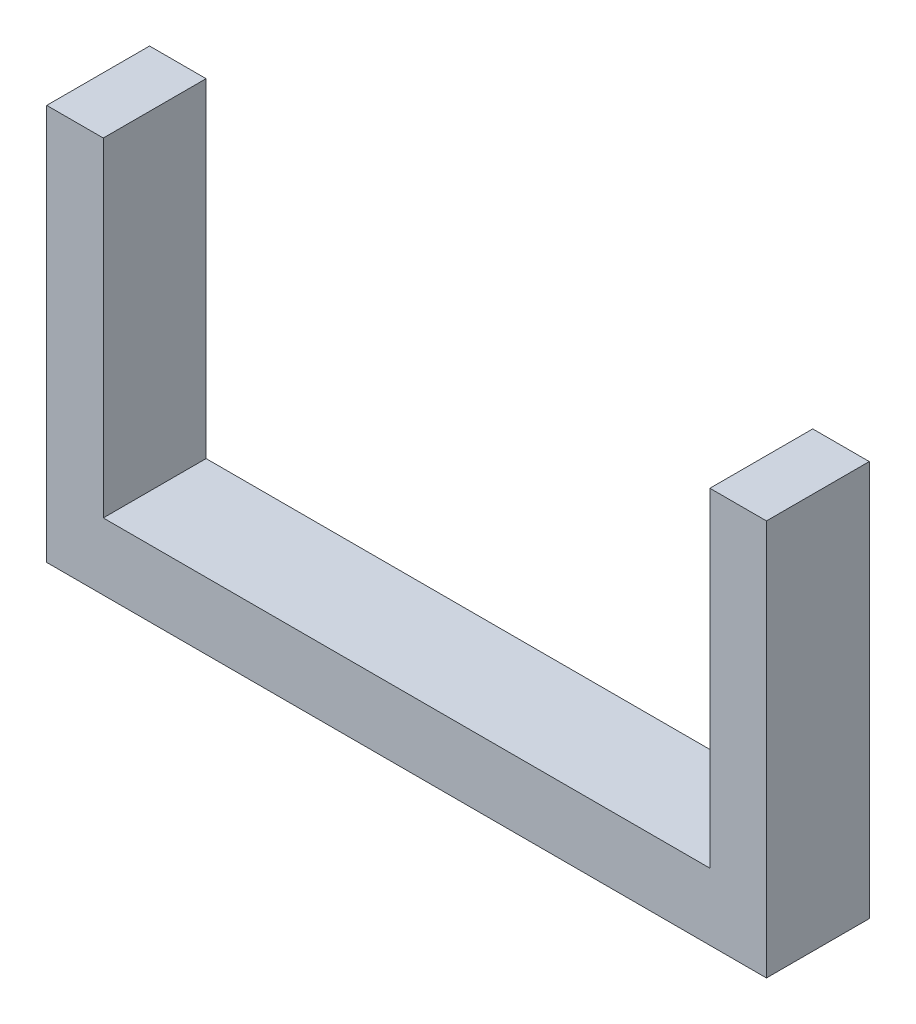
ISO-10303-21;
HEADER;
FILE_DESCRIPTION(('STEP AP214'),'2;1');
FILE_NAME('part.step','',(''),(''),'','','');
FILE_SCHEMA(('AUTOMOTIVE_DESIGN { 1 0 10303 214 1 1 1 1 }'));
ENDSEC;
DATA;
#1=APPLICATION_CONTEXT('core data for automotive mechanical design processes');
#2=APPLICATION_PROTOCOL_DEFINITION('international standard','automotive_design',2000,#1);
#3=PRODUCT_CONTEXT('',#1,'mechanical');
#4=PRODUCT('Part','Part','',(#3));
#5=PRODUCT_RELATED_PRODUCT_CATEGORY('part','',(#4));
#6=PRODUCT_DEFINITION_FORMATION('','',#4);
#7=PRODUCT_DEFINITION_CONTEXT('part definition',#1,'design');
#8=PRODUCT_DEFINITION('design','',#6,#7);
#9=PRODUCT_DEFINITION_SHAPE('','',#8);
#10=(LENGTH_UNIT() NAMED_UNIT(*) SI_UNIT(.MILLI.,.METRE.));
#11=(NAMED_UNIT(*) PLANE_ANGLE_UNIT() SI_UNIT($,.RADIAN.));
#12=(NAMED_UNIT(*) SI_UNIT($,.STERADIAN.) SOLID_ANGLE_UNIT());
#13=UNCERTAINTY_MEASURE_WITH_UNIT(LENGTH_MEASURE(1.E-05),#10,'distance_accuracy_value','');
#14=(GEOMETRIC_REPRESENTATION_CONTEXT(3) GLOBAL_UNCERTAINTY_ASSIGNED_CONTEXT((#13)) GLOBAL_UNIT_ASSIGNED_CONTEXT((#10,
#11,#12)) REPRESENTATION_CONTEXT('',''));
#15=CARTESIAN_POINT('',(0.,0.,0.));
#16=DIRECTION('',(0.,0.,1.));
#17=DIRECTION('',(1.,0.,0.));
#18=AXIS2_PLACEMENT_3D('',#15,#16,#17);
#19=CARTESIAN_POINT('',(0.,0.,4.));
#20=DIRECTION('',(0.,0.,-1.));
#21=DIRECTION('',(-1.,0.,0.));
#22=AXIS2_PLACEMENT_3D('',#19,#20,#21);
#23=PLANE('',#22);
#24=DIRECTION('',(1.,0.,0.));
#25=VECTOR('',#24,1.);
#26=CARTESIAN_POINT('',(-20.,6.4,4.));
#27=LINE('',#26,#25);
#28=CARTESIAN_POINT('',(-14.,6.4,4.));
#29=VERTEX_POINT('',#28);
#30=CARTESIAN_POINT('',(-11.8,6.4,4.));
#31=VERTEX_POINT('',#30);
#32=EDGE_CURVE('E81',#29,#31,#27,.T.);
#33=ORIENTED_EDGE('',*,*,#32,.F.);
#34=DIRECTION('',(0.,-1.,0.));
#35=VECTOR('',#34,1.);
#36=CARTESIAN_POINT('',(-14.,-9.,4.));
#37=LINE('',#36,#35);
#38=CARTESIAN_POINT('',(-14.,-9.,4.));
#39=VERTEX_POINT('',#38);
#40=EDGE_CURVE('E132',#29,#39,#37,.T.);
#41=ORIENTED_EDGE('',*,*,#40,.T.);
#42=DIRECTION('',(1.,0.,0.));
#43=VECTOR('',#42,1.);
#44=CARTESIAN_POINT('',(-14.,-9.,4.));
#45=LINE('',#44,#43);
#46=CARTESIAN_POINT('',(14.,-9.,4.));
#47=VERTEX_POINT('',#46);
#48=EDGE_CURVE('E60',#39,#47,#45,.T.);
#49=ORIENTED_EDGE('',*,*,#48,.T.);
#50=DIRECTION('',(0.,1.,0.));
#51=VECTOR('',#50,1.);
#52=CARTESIAN_POINT('',(14.,-9.,4.));
#53=LINE('',#52,#51);
#54=CARTESIAN_POINT('',(14.,6.4,4.));
#55=VERTEX_POINT('',#54);
#56=EDGE_CURVE('E146',#47,#55,#53,.T.);
#57=ORIENTED_EDGE('',*,*,#56,.T.);
#58=CARTESIAN_POINT('',(11.8,6.4,4.));
#59=VERTEX_POINT('',#58);
#60=EDGE_CURVE('E129',#59,#55,#27,.T.);
#61=ORIENTED_EDGE('',*,*,#60,.F.);
#62=DIRECTION('',(0.,1.,0.));
#63=VECTOR('',#62,1.);
#64=CARTESIAN_POINT('',(11.8,-6.4,4.));
#65=LINE('',#64,#63);
#66=CARTESIAN_POINT('',(11.8,-6.4,4.));
#67=VERTEX_POINT('',#66);
#68=EDGE_CURVE('E160',#67,#59,#65,.T.);
#69=ORIENTED_EDGE('',*,*,#68,.F.);
#70=DIRECTION('',(1.,0.,0.));
#71=VECTOR('',#70,1.);
#72=CARTESIAN_POINT('',(-11.8,-6.4,4.));
#73=LINE('',#72,#71);
#74=CARTESIAN_POINT('',(-11.8,-6.4,4.));
#75=VERTEX_POINT('',#74);
#76=EDGE_CURVE('E170',#75,#67,#73,.T.);
#77=ORIENTED_EDGE('',*,*,#76,.F.);
#78=DIRECTION('',(0.,-1.,0.));
#79=VECTOR('',#78,1.);
#80=CARTESIAN_POINT('',(-11.8,-6.4,4.));
#81=LINE('',#80,#79);
#82=EDGE_CURVE('E106',#31,#75,#81,.T.);
#83=ORIENTED_EDGE('',*,*,#82,.F.);
#84=EDGE_LOOP('',(#33,#41,#49,#57,#61,#69,#77,#83));
#85=FACE_BOUND('',#84,.T.);
#86=ADVANCED_FACE('F43',(#85),#23,.F.);
#87=CARTESIAN_POINT('',(0.,0.,0.));
#88=DIRECTION('',(0.,0.,-1.));
#89=DIRECTION('',(-1.,0.,0.));
#90=AXIS2_PLACEMENT_3D('',#87,#88,#89);
#91=PLANE('',#90);
#92=DIRECTION('',(0.,-1.,0.));
#93=VECTOR('',#92,1.);
#94=CARTESIAN_POINT('',(-14.,-9.,0.));
#95=LINE('',#94,#93);
#96=CARTESIAN_POINT('',(-14.,6.4,0.));
#97=VERTEX_POINT('',#96);
#98=CARTESIAN_POINT('',(-14.,-9.,0.));
#99=VERTEX_POINT('',#98);
#100=EDGE_CURVE('E71',#97,#99,#95,.T.);
#101=ORIENTED_EDGE('',*,*,#100,.F.);
#102=DIRECTION('',(1.,0.,0.));
#103=VECTOR('',#102,1.);
#104=CARTESIAN_POINT('',(-20.,6.4,0.));
#105=LINE('',#104,#103);
#106=CARTESIAN_POINT('',(-11.8,6.4,0.));
#107=VERTEX_POINT('',#106);
#108=EDGE_CURVE('E122',#97,#107,#105,.T.);
#109=ORIENTED_EDGE('',*,*,#108,.T.);
#110=DIRECTION('',(0.,-1.,0.));
#111=VECTOR('',#110,1.);
#112=CARTESIAN_POINT('',(-11.8,-6.4,0.));
#113=LINE('',#112,#111);
#114=CARTESIAN_POINT('',(-11.8,-6.4,0.));
#115=VERTEX_POINT('',#114);
#116=EDGE_CURVE('E133',#107,#115,#113,.T.);
#117=ORIENTED_EDGE('',*,*,#116,.T.);
#118=DIRECTION('',(1.,0.,0.));
#119=VECTOR('',#118,1.);
#120=CARTESIAN_POINT('',(-11.8,-6.4,0.));
#121=LINE('',#120,#119);
#122=CARTESIAN_POINT('',(11.8,-6.4,0.));
#123=VERTEX_POINT('',#122);
#124=EDGE_CURVE('E164',#115,#123,#121,.T.);
#125=ORIENTED_EDGE('',*,*,#124,.T.);
#126=DIRECTION('',(0.,1.,0.));
#127=VECTOR('',#126,1.);
#128=CARTESIAN_POINT('',(11.8,-6.4,0.));
#129=LINE('',#128,#127);
#130=CARTESIAN_POINT('',(11.8,6.4,0.));
#131=VERTEX_POINT('',#130);
#132=EDGE_CURVE('E161',#123,#131,#129,.T.);
#133=ORIENTED_EDGE('',*,*,#132,.T.);
#134=CARTESIAN_POINT('',(14.,6.4,0.));
#135=VERTEX_POINT('',#134);
#136=EDGE_CURVE('E100',#131,#135,#105,.T.);
#137=ORIENTED_EDGE('',*,*,#136,.T.);
#138=DIRECTION('',(0.,1.,0.));
#139=VECTOR('',#138,1.);
#140=CARTESIAN_POINT('',(14.,-9.,0.));
#141=LINE('',#140,#139);
#142=CARTESIAN_POINT('',(14.,-9.,0.));
#143=VERTEX_POINT('',#142);
#144=EDGE_CURVE('E141',#143,#135,#141,.T.);
#145=ORIENTED_EDGE('',*,*,#144,.F.);
#146=DIRECTION('',(1.,0.,0.));
#147=VECTOR('',#146,1.);
#148=CARTESIAN_POINT('',(-14.,-9.,0.));
#149=LINE('',#148,#147);
#150=EDGE_CURVE('E138',#99,#143,#149,.T.);
#151=ORIENTED_EDGE('',*,*,#150,.F.);
#152=EDGE_LOOP('',(#101,#109,#117,#125,#133,#137,#145,#151));
#153=FACE_BOUND('',#152,.T.);
#154=ADVANCED_FACE('F136',(#153),#91,.T.);
#155=CARTESIAN_POINT('',(-14.,-9.,4.));
#156=DIRECTION('',(1.,0.,0.));
#157=DIRECTION('',(0.,0.,-1.));
#158=AXIS2_PLACEMENT_3D('',#155,#156,#157);
#159=PLANE('',#158);
#160=DIRECTION('',(0.,0.,1.));
#161=VECTOR('',#160,1.);
#162=CARTESIAN_POINT('',(-14.,6.4,4.));
#163=LINE('',#162,#161);
#164=EDGE_CURVE('E124',#97,#29,#163,.T.);
#165=ORIENTED_EDGE('',*,*,#164,.F.);
#166=ORIENTED_EDGE('',*,*,#100,.T.);
#167=DIRECTION('',(0.,0.,-1.));
#168=VECTOR('',#167,1.);
#169=CARTESIAN_POINT('',(-14.,-9.,4.));
#170=LINE('',#169,#168);
#171=EDGE_CURVE('E11',#39,#99,#170,.T.);
#172=ORIENTED_EDGE('',*,*,#171,.F.);
#173=ORIENTED_EDGE('',*,*,#40,.F.);
#174=EDGE_LOOP('',(#165,#166,#172,#173));
#175=FACE_BOUND('',#174,.T.);
#176=ADVANCED_FACE('F45',(#175),#159,.F.);
#177=CARTESIAN_POINT('',(14.,-9.,4.));
#178=DIRECTION('',(-1.,0.,0.));
#179=DIRECTION('',(0.,0.,1.));
#180=AXIS2_PLACEMENT_3D('',#177,#178,#179);
#181=PLANE('',#180);
#182=DIRECTION('',(0.,0.,-1.));
#183=VECTOR('',#182,1.);
#184=CARTESIAN_POINT('',(14.,6.4,4.));
#185=LINE('',#184,#183);
#186=EDGE_CURVE('E134',#55,#135,#185,.T.);
#187=ORIENTED_EDGE('',*,*,#186,.F.);
#188=ORIENTED_EDGE('',*,*,#56,.F.);
#189=DIRECTION('',(0.,0.,-1.));
#190=VECTOR('',#189,1.);
#191=CARTESIAN_POINT('',(14.,-9.,4.));
#192=LINE('',#191,#190);
#193=EDGE_CURVE('E52',#47,#143,#192,.T.);
#194=ORIENTED_EDGE('',*,*,#193,.T.);
#195=ORIENTED_EDGE('',*,*,#144,.T.);
#196=EDGE_LOOP('',(#187,#188,#194,#195));
#197=FACE_BOUND('',#196,.T.);
#198=ADVANCED_FACE('F177',(#197),#181,.F.);
#199=CARTESIAN_POINT('',(-14.,-9.,4.));
#200=DIRECTION('',(0.,1.,0.));
#201=DIRECTION('',(0.,0.,1.));
#202=AXIS2_PLACEMENT_3D('',#199,#200,#201);
#203=PLANE('',#202);
#204=ORIENTED_EDGE('',*,*,#150,.T.);
#205=ORIENTED_EDGE('',*,*,#193,.F.);
#206=ORIENTED_EDGE('',*,*,#48,.F.);
#207=ORIENTED_EDGE('',*,*,#171,.T.);
#208=EDGE_LOOP('',(#204,#205,#206,#207));
#209=FACE_BOUND('',#208,.T.);
#210=ADVANCED_FACE('F187',(#209),#203,.F.);
#211=CARTESIAN_POINT('',(-11.8,-6.4,4.));
#212=DIRECTION('',(1.,0.,0.));
#213=DIRECTION('',(0.,0.,-1.));
#214=AXIS2_PLACEMENT_3D('',#211,#212,#213);
#215=PLANE('',#214);
#216=ORIENTED_EDGE('',*,*,#116,.F.);
#217=DIRECTION('',(0.,0.,-1.));
#218=VECTOR('',#217,1.);
#219=CARTESIAN_POINT('',(-11.8,6.4,4.));
#220=LINE('',#219,#218);
#221=EDGE_CURVE('E125',#31,#107,#220,.T.);
#222=ORIENTED_EDGE('',*,*,#221,.F.);
#223=ORIENTED_EDGE('',*,*,#82,.T.);
#224=DIRECTION('',(0.,0.,-1.));
#225=VECTOR('',#224,1.);
#226=CARTESIAN_POINT('',(-11.8,-6.4,4.));
#227=LINE('',#226,#225);
#228=EDGE_CURVE('E139',#75,#115,#227,.T.);
#229=ORIENTED_EDGE('',*,*,#228,.T.);
#230=EDGE_LOOP('',(#216,#222,#223,#229));
#231=FACE_BOUND('',#230,.T.);
#232=ADVANCED_FACE('F185',(#231),#215,.T.);
#233=CARTESIAN_POINT('',(-11.8,-6.4,4.));
#234=DIRECTION('',(0.,1.,0.));
#235=DIRECTION('',(0.,0.,1.));
#236=AXIS2_PLACEMENT_3D('',#233,#234,#235);
#237=PLANE('',#236);
#238=ORIENTED_EDGE('',*,*,#124,.F.);
#239=ORIENTED_EDGE('',*,*,#228,.F.);
#240=ORIENTED_EDGE('',*,*,#76,.T.);
#241=DIRECTION('',(0.,0.,-1.));
#242=VECTOR('',#241,1.);
#243=CARTESIAN_POINT('',(11.8,-6.4,4.));
#244=LINE('',#243,#242);
#245=EDGE_CURVE('E143',#67,#123,#244,.T.);
#246=ORIENTED_EDGE('',*,*,#245,.T.);
#247=EDGE_LOOP('',(#238,#239,#240,#246));
#248=FACE_BOUND('',#247,.T.);
#249=ADVANCED_FACE('F184',(#248),#237,.T.);
#250=CARTESIAN_POINT('',(11.8,-6.4,4.));
#251=DIRECTION('',(-1.,0.,0.));
#252=DIRECTION('',(0.,0.,1.));
#253=AXIS2_PLACEMENT_3D('',#250,#251,#252);
#254=PLANE('',#253);
#255=ORIENTED_EDGE('',*,*,#132,.F.);
#256=ORIENTED_EDGE('',*,*,#245,.F.);
#257=ORIENTED_EDGE('',*,*,#68,.T.);
#258=DIRECTION('',(0.,0.,-1.));
#259=VECTOR('',#258,1.);
#260=CARTESIAN_POINT('',(11.8,6.4,4.));
#261=LINE('',#260,#259);
#262=EDGE_CURVE('E157',#59,#131,#261,.T.);
#263=ORIENTED_EDGE('',*,*,#262,.T.);
#264=EDGE_LOOP('',(#255,#256,#257,#263));
#265=FACE_BOUND('',#264,.T.);
#266=ADVANCED_FACE('F181',(#265),#254,.T.);
#267=CARTESIAN_POINT('',(-20.,6.4,4.));
#268=DIRECTION('',(0.,1.,0.));
#269=DIRECTION('',(0.,0.,1.));
#270=AXIS2_PLACEMENT_3D('',#267,#268,#269);
#271=PLANE('',#270);
#272=ORIENTED_EDGE('',*,*,#186,.T.);
#273=ORIENTED_EDGE('',*,*,#136,.F.);
#274=ORIENTED_EDGE('',*,*,#262,.F.);
#275=ORIENTED_EDGE('',*,*,#60,.T.);
#276=EDGE_LOOP('',(#272,#273,#274,#275));
#277=FACE_BOUND('',#276,.T.);
#278=ADVANCED_FACE('F175',(#277),#271,.T.);
#279=ORIENTED_EDGE('',*,*,#164,.T.);
#280=ORIENTED_EDGE('',*,*,#32,.T.);
#281=ORIENTED_EDGE('',*,*,#221,.T.);
#282=ORIENTED_EDGE('',*,*,#108,.F.);
#283=EDGE_LOOP('',(#279,#280,#281,#282));
#284=FACE_BOUND('',#283,.T.);
#285=ADVANCED_FACE('F123',(#284),#271,.T.);
#286=CLOSED_SHELL('',(#86,#154,#176,#198,#210,#232,#249,#266,#278,#285));
#287=MANIFOLD_SOLID_BREP('B2',#286);
#288=ADVANCED_BREP_SHAPE_REPRESENTATION('',(#18,#287),#14);
#289=SHAPE_DEFINITION_REPRESENTATION(#9,#288);
ENDSEC;
END-ISO-10303-21;
